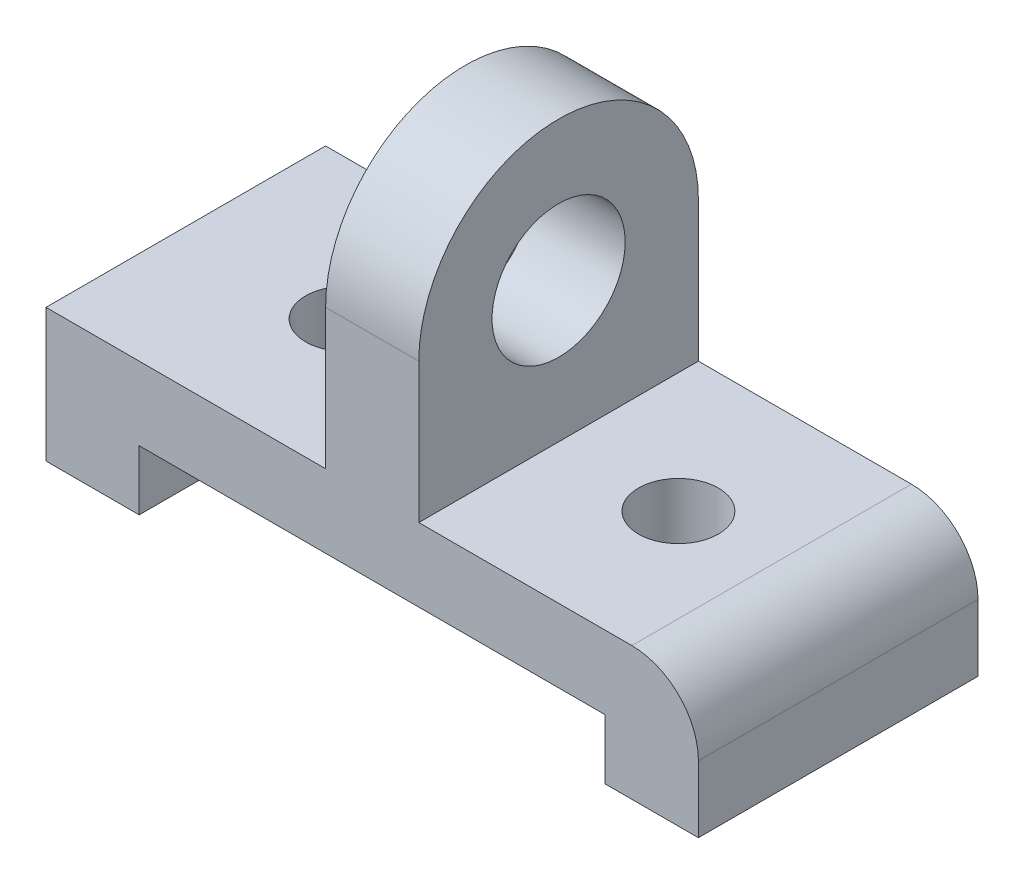
ISO-10303-21;
HEADER;
FILE_DESCRIPTION(('STEP AP214'),'2;1');
FILE_NAME('part.step','',(''),(''),'','','');
FILE_SCHEMA(('AUTOMOTIVE_DESIGN { 1 0 10303 214 1 1 1 1 }'));
ENDSEC;
DATA;
#1=APPLICATION_CONTEXT('core data for automotive mechanical design processes');
#2=APPLICATION_PROTOCOL_DEFINITION('international standard','automotive_design',2000,#1);
#3=PRODUCT_CONTEXT('',#1,'mechanical');
#4=PRODUCT('Part','Part','',(#3));
#5=PRODUCT_RELATED_PRODUCT_CATEGORY('part','',(#4));
#6=PRODUCT_DEFINITION_FORMATION('','',#4);
#7=PRODUCT_DEFINITION_CONTEXT('part definition',#1,'design');
#8=PRODUCT_DEFINITION('design','',#6,#7);
#9=PRODUCT_DEFINITION_SHAPE('','',#8);
#10=(LENGTH_UNIT() NAMED_UNIT(*) SI_UNIT(.MILLI.,.METRE.));
#11=(NAMED_UNIT(*) PLANE_ANGLE_UNIT() SI_UNIT($,.RADIAN.));
#12=(NAMED_UNIT(*) SI_UNIT($,.STERADIAN.) SOLID_ANGLE_UNIT());
#13=UNCERTAINTY_MEASURE_WITH_UNIT(LENGTH_MEASURE(1.E-05),#10,'distance_accuracy_value','');
#14=(GEOMETRIC_REPRESENTATION_CONTEXT(3) GLOBAL_UNCERTAINTY_ASSIGNED_CONTEXT((#13)) GLOBAL_UNIT_ASSIGNED_CONTEXT((#10,
#11,#12)) REPRESENTATION_CONTEXT('',''));
#15=CARTESIAN_POINT('',(0.,0.,0.));
#16=DIRECTION('',(0.,0.,1.));
#17=DIRECTION('',(1.,0.,0.));
#18=AXIS2_PLACEMENT_3D('',#15,#16,#17);
#19=CARTESIAN_POINT('',(0.,20.,0.));
#20=DIRECTION('',(0.,1.,0.));
#21=DIRECTION('',(0.,0.,1.));
#22=AXIS2_PLACEMENT_3D('',#19,#20,#21);
#23=PLANE('',#22);
#24=CARTESIAN_POINT('',(25.,20.,0.));
#25=DIRECTION('',(0.,1.,0.));
#26=DIRECTION('',(0.,0.,1.));
#27=AXIS2_PLACEMENT_3D('',#24,#25,#26);
#28=CIRCLE('',#27,6.);
#29=CARTESIAN_POINT('',(25.,20.,6.));
#30=VERTEX_POINT('',#29);
#31=EDGE_CURVE('E168',#30,#30,#28,.T.);
#32=ORIENTED_EDGE('',*,*,#31,.F.);
#33=EDGE_LOOP('',(#32));
#34=FACE_BOUND('',#33,.T.);
#35=DIRECTION('',(1.,0.,0.));
#36=VECTOR('',#35,1.);
#37=CARTESIAN_POINT('',(-49.,20.,21.));
#38=LINE('',#37,#36);
#39=CARTESIAN_POINT('',(7.,20.,21.));
#40=VERTEX_POINT('',#39);
#41=CARTESIAN_POINT('',(39.,20.,21.));
#42=VERTEX_POINT('',#41);
#43=EDGE_CURVE('E230',#40,#42,#38,.T.);
#44=ORIENTED_EDGE('',*,*,#43,.T.);
#45=DIRECTION('',(0.,0.,-1.));
#46=VECTOR('',#45,1.);
#47=CARTESIAN_POINT('',(39.,20.,-21.));
#48=LINE('',#47,#46);
#49=CARTESIAN_POINT('',(39.,20.,-21.));
#50=VERTEX_POINT('',#49);
#51=EDGE_CURVE('E264',#42,#50,#48,.T.);
#52=ORIENTED_EDGE('',*,*,#51,.T.);
#53=DIRECTION('',(-1.,0.,0.));
#54=VECTOR('',#53,1.);
#55=CARTESIAN_POINT('',(-49.,20.,-21.));
#56=LINE('',#55,#54);
#57=CARTESIAN_POINT('',(7.,20.,-21.));
#58=VERTEX_POINT('',#57);
#59=EDGE_CURVE('E223',#50,#58,#56,.T.);
#60=ORIENTED_EDGE('',*,*,#59,.T.);
#61=DIRECTION('',(0.,0.,-1.));
#62=VECTOR('',#61,1.);
#63=CARTESIAN_POINT('',(7.,20.,-21.));
#64=LINE('',#63,#62);
#65=EDGE_CURVE('E140',#40,#58,#64,.T.);
#66=ORIENTED_EDGE('',*,*,#65,.F.);
#67=EDGE_LOOP('',(#44,#52,#60,#66));
#68=FACE_BOUND('',#67,.T.);
#69=ADVANCED_FACE('F39',(#34,#68),#23,.T.);
#70=CARTESIAN_POINT('',(0.,0.,0.));
#71=DIRECTION('',(0.,1.,0.));
#72=DIRECTION('',(0.,0.,1.));
#73=AXIS2_PLACEMENT_3D('',#70,#71,#72);
#74=PLANE('',#73);
#75=DIRECTION('',(-1.,0.,0.));
#76=VECTOR('',#75,1.);
#77=CARTESIAN_POINT('',(-49.,0.,-21.));
#78=LINE('',#77,#76);
#79=CARTESIAN_POINT('',(-35.,0.,-21.));
#80=VERTEX_POINT('',#79);
#81=CARTESIAN_POINT('',(-49.,0.,-21.));
#82=VERTEX_POINT('',#81);
#83=EDGE_CURVE('E239',#80,#82,#78,.T.);
#84=ORIENTED_EDGE('',*,*,#83,.F.);
#85=DIRECTION('',(0.,0.,1.));
#86=VECTOR('',#85,1.);
#87=CARTESIAN_POINT('',(-35.,0.,-21.));
#88=LINE('',#87,#86);
#89=CARTESIAN_POINT('',(-35.,0.,21.));
#90=VERTEX_POINT('',#89);
#91=EDGE_CURVE('E200',#80,#90,#88,.T.);
#92=ORIENTED_EDGE('',*,*,#91,.T.);
#93=DIRECTION('',(1.,0.,0.));
#94=VECTOR('',#93,1.);
#95=CARTESIAN_POINT('',(-49.,0.,21.));
#96=LINE('',#95,#94);
#97=CARTESIAN_POINT('',(-49.,0.,21.));
#98=VERTEX_POINT('',#97);
#99=EDGE_CURVE('E248',#98,#90,#96,.T.);
#100=ORIENTED_EDGE('',*,*,#99,.F.);
#101=DIRECTION('',(0.,0.,1.));
#102=VECTOR('',#101,1.);
#103=CARTESIAN_POINT('',(-49.,0.,-21.));
#104=LINE('',#103,#102);
#105=EDGE_CURVE('E244',#82,#98,#104,.T.);
#106=ORIENTED_EDGE('',*,*,#105,.F.);
#107=EDGE_LOOP('',(#84,#92,#100,#106));
#108=FACE_BOUND('',#107,.T.);
#109=ADVANCED_FACE('F292',(#108),#74,.F.);
#110=CARTESIAN_POINT('',(49.,20.,-21.));
#111=DIRECTION('',(-1.,0.,0.));
#112=DIRECTION('',(0.,0.,1.));
#113=AXIS2_PLACEMENT_3D('',#110,#111,#112);
#114=PLANE('',#113);
#115=DIRECTION('',(0.,-1.,0.));
#116=VECTOR('',#115,1.);
#117=CARTESIAN_POINT('',(49.,20.,-21.));
#118=LINE('',#117,#116);
#119=CARTESIAN_POINT('',(49.,10.,-21.));
#120=VERTEX_POINT('',#119);
#121=CARTESIAN_POINT('',(49.,0.,-21.));
#122=VERTEX_POINT('',#121);
#123=EDGE_CURVE('E262',#120,#122,#118,.T.);
#124=ORIENTED_EDGE('',*,*,#123,.F.);
#125=DIRECTION('',(0.,0.,-1.));
#126=VECTOR('',#125,1.);
#127=CARTESIAN_POINT('',(49.,10.,21.));
#128=LINE('',#127,#126);
#129=CARTESIAN_POINT('',(49.,10.,21.));
#130=VERTEX_POINT('',#129);
#131=EDGE_CURVE('E48',#120,#130,#128,.F.);
#132=ORIENTED_EDGE('',*,*,#131,.T.);
#133=DIRECTION('',(0.,-1.,0.));
#134=VECTOR('',#133,1.);
#135=CARTESIAN_POINT('',(49.,20.,21.));
#136=LINE('',#135,#134);
#137=CARTESIAN_POINT('',(49.,0.,21.));
#138=VERTEX_POINT('',#137);
#139=EDGE_CURVE('E235',#130,#138,#136,.T.);
#140=ORIENTED_EDGE('',*,*,#139,.T.);
#141=DIRECTION('',(0.,0.,-1.));
#142=VECTOR('',#141,1.);
#143=CARTESIAN_POINT('',(49.,0.,-21.));
#144=LINE('',#143,#142);
#145=EDGE_CURVE('E213',#138,#122,#144,.T.);
#146=ORIENTED_EDGE('',*,*,#145,.T.);
#147=EDGE_LOOP('',(#124,#132,#140,#146));
#148=FACE_BOUND('',#147,.T.);
#149=ADVANCED_FACE('F325',(#148),#114,.F.);
#150=CARTESIAN_POINT('',(-49.,20.,-21.));
#151=DIRECTION('',(0.,0.,1.));
#152=DIRECTION('',(1.,0.,0.));
#153=AXIS2_PLACEMENT_3D('',#150,#151,#152);
#154=PLANE('',#153);
#155=ORIENTED_EDGE('',*,*,#59,.F.);
#156=CARTESIAN_POINT('',(39.,10.,-21.));
#157=DIRECTION('',(0.,0.,1.));
#158=DIRECTION('',(1.,0.,0.));
#159=AXIS2_PLACEMENT_3D('',#156,#157,#158);
#160=CIRCLE('',#159,10.);
#161=EDGE_CURVE('E62',#50,#120,#160,.F.);
#162=ORIENTED_EDGE('',*,*,#161,.T.);
#163=ORIENTED_EDGE('',*,*,#123,.T.);
#164=CARTESIAN_POINT('',(35.,0.,-21.));
#165=VERTEX_POINT('',#164);
#166=EDGE_CURVE('E240',#122,#165,#78,.T.);
#167=ORIENTED_EDGE('',*,*,#166,.T.);
#168=DIRECTION('',(0.,1.,0.));
#169=VECTOR('',#168,1.);
#170=CARTESIAN_POINT('',(35.,0.,-21.));
#171=LINE('',#170,#169);
#172=CARTESIAN_POINT('',(35.,9.,-21.));
#173=VERTEX_POINT('',#172);
#174=EDGE_CURVE('E191',#165,#173,#171,.T.);
#175=ORIENTED_EDGE('',*,*,#174,.T.);
#176=DIRECTION('',(-1.,0.,0.));
#177=VECTOR('',#176,1.);
#178=CARTESIAN_POINT('',(-35.,9.,-21.));
#179=LINE('',#178,#177);
#180=CARTESIAN_POINT('',(-35.,9.,-21.));
#181=VERTEX_POINT('',#180);
#182=EDGE_CURVE('E196',#173,#181,#179,.T.);
#183=ORIENTED_EDGE('',*,*,#182,.T.);
#184=DIRECTION('',(0.,-1.,0.));
#185=VECTOR('',#184,1.);
#186=CARTESIAN_POINT('',(-35.,0.,-21.));
#187=LINE('',#186,#185);
#188=EDGE_CURVE('E187',#181,#80,#187,.T.);
#189=ORIENTED_EDGE('',*,*,#188,.T.);
#190=ORIENTED_EDGE('',*,*,#83,.T.);
#191=DIRECTION('',(0.,-1.,0.));
#192=VECTOR('',#191,1.);
#193=CARTESIAN_POINT('',(-49.,20.,-21.));
#194=LINE('',#193,#192);
#195=CARTESIAN_POINT('',(-49.,20.,-21.));
#196=VERTEX_POINT('',#195);
#197=EDGE_CURVE('E258',#196,#82,#194,.T.);
#198=ORIENTED_EDGE('',*,*,#197,.F.);
#199=CARTESIAN_POINT('',(-7.,20.,-21.));
#200=VERTEX_POINT('',#199);
#201=EDGE_CURVE('E227',#200,#196,#56,.T.);
#202=ORIENTED_EDGE('',*,*,#201,.F.);
#203=DIRECTION('',(0.,-1.,0.));
#204=VECTOR('',#203,1.);
#205=CARTESIAN_POINT('',(-7.,41.,-21.));
#206=LINE('',#205,#204);
#207=CARTESIAN_POINT('',(-7.,41.,-21.));
#208=VERTEX_POINT('',#207);
#209=EDGE_CURVE('E143',#208,#200,#206,.T.);
#210=ORIENTED_EDGE('',*,*,#209,.F.);
#211=DIRECTION('',(-1.,0.,0.));
#212=VECTOR('',#211,1.);
#213=CARTESIAN_POINT('',(-7.,41.,-21.));
#214=LINE('',#213,#212);
#215=CARTESIAN_POINT('',(7.,41.,-21.));
#216=VERTEX_POINT('',#215);
#217=EDGE_CURVE('E146',#216,#208,#214,.T.);
#218=ORIENTED_EDGE('',*,*,#217,.F.);
#219=DIRECTION('',(0.,-1.,0.));
#220=VECTOR('',#219,1.);
#221=CARTESIAN_POINT('',(7.,41.,-21.));
#222=LINE('',#221,#220);
#223=EDGE_CURVE('E134',#216,#58,#222,.T.);
#224=ORIENTED_EDGE('',*,*,#223,.T.);
#225=EDGE_LOOP('',(#155,#162,#163,#167,#175,#183,#189,#190,#198,#202,#210,#218,#224));
#226=FACE_BOUND('',#225,.T.);
#227=ADVANCED_FACE('F147',(#226),#154,.F.);
#228=CARTESIAN_POINT('',(-49.,20.,-21.));
#229=DIRECTION('',(1.,0.,0.));
#230=DIRECTION('',(0.,0.,-1.));
#231=AXIS2_PLACEMENT_3D('',#228,#229,#230);
#232=PLANE('',#231);
#233=ORIENTED_EDGE('',*,*,#105,.T.);
#234=DIRECTION('',(0.,-1.,0.));
#235=VECTOR('',#234,1.);
#236=CARTESIAN_POINT('',(-49.,20.,21.));
#237=LINE('',#236,#235);
#238=CARTESIAN_POINT('',(-49.,20.,21.));
#239=VERTEX_POINT('',#238);
#240=EDGE_CURVE('E254',#239,#98,#237,.T.);
#241=ORIENTED_EDGE('',*,*,#240,.F.);
#242=DIRECTION('',(0.,0.,1.));
#243=VECTOR('',#242,1.);
#244=CARTESIAN_POINT('',(-49.,20.,-21.));
#245=LINE('',#244,#243);
#246=EDGE_CURVE('E226',#196,#239,#245,.T.);
#247=ORIENTED_EDGE('',*,*,#246,.F.);
#248=ORIENTED_EDGE('',*,*,#197,.T.);
#249=EDGE_LOOP('',(#233,#241,#247,#248));
#250=FACE_BOUND('',#249,.T.);
#251=ADVANCED_FACE('F289',(#250),#232,.F.);
#252=CARTESIAN_POINT('',(-49.,20.,21.));
#253=DIRECTION('',(0.,0.,-1.));
#254=DIRECTION('',(-1.,0.,0.));
#255=AXIS2_PLACEMENT_3D('',#252,#253,#254);
#256=PLANE('',#255);
#257=ORIENTED_EDGE('',*,*,#139,.F.);
#258=CARTESIAN_POINT('',(39.,10.,21.));
#259=DIRECTION('',(0.,0.,-1.));
#260=DIRECTION('',(-1.,0.,0.));
#261=AXIS2_PLACEMENT_3D('',#258,#259,#260);
#262=CIRCLE('',#261,10.);
#263=EDGE_CURVE('E11',#130,#42,#262,.F.);
#264=ORIENTED_EDGE('',*,*,#263,.T.);
#265=ORIENTED_EDGE('',*,*,#43,.F.);
#266=DIRECTION('',(0.,-1.,0.));
#267=VECTOR('',#266,1.);
#268=CARTESIAN_POINT('',(7.,41.,21.));
#269=LINE('',#268,#267);
#270=CARTESIAN_POINT('',(7.,41.,21.));
#271=VERTEX_POINT('',#270);
#272=EDGE_CURVE('E174',#271,#40,#269,.T.);
#273=ORIENTED_EDGE('',*,*,#272,.F.);
#274=DIRECTION('',(1.,0.,0.));
#275=VECTOR('',#274,1.);
#276=CARTESIAN_POINT('',(-7.,41.,21.));
#277=LINE('',#276,#275);
#278=CARTESIAN_POINT('',(-7.,41.,21.));
#279=VERTEX_POINT('',#278);
#280=EDGE_CURVE('E154',#279,#271,#277,.T.);
#281=ORIENTED_EDGE('',*,*,#280,.F.);
#282=DIRECTION('',(0.,-1.,0.));
#283=VECTOR('',#282,1.);
#284=CARTESIAN_POINT('',(-7.,41.,21.));
#285=LINE('',#284,#283);
#286=CARTESIAN_POINT('',(-7.,20.,21.));
#287=VERTEX_POINT('',#286);
#288=EDGE_CURVE('E181',#279,#287,#285,.T.);
#289=ORIENTED_EDGE('',*,*,#288,.T.);
#290=EDGE_CURVE('E231',#239,#287,#38,.T.);
#291=ORIENTED_EDGE('',*,*,#290,.F.);
#292=ORIENTED_EDGE('',*,*,#240,.T.);
#293=ORIENTED_EDGE('',*,*,#99,.T.);
#294=DIRECTION('',(0.,-1.,0.));
#295=VECTOR('',#294,1.);
#296=CARTESIAN_POINT('',(-35.,0.,21.));
#297=LINE('',#296,#295);
#298=CARTESIAN_POINT('',(-35.,9.,21.));
#299=VERTEX_POINT('',#298);
#300=EDGE_CURVE('E142',#299,#90,#297,.T.);
#301=ORIENTED_EDGE('',*,*,#300,.F.);
#302=DIRECTION('',(-1.,0.,0.));
#303=VECTOR('',#302,1.);
#304=CARTESIAN_POINT('',(-35.,9.,21.));
#305=LINE('',#304,#303);
#306=CARTESIAN_POINT('',(35.,9.,21.));
#307=VERTEX_POINT('',#306);
#308=EDGE_CURVE('E192',#307,#299,#305,.T.);
#309=ORIENTED_EDGE('',*,*,#308,.F.);
#310=DIRECTION('',(0.,1.,0.));
#311=VECTOR('',#310,1.);
#312=CARTESIAN_POINT('',(35.,0.,21.));
#313=LINE('',#312,#311);
#314=CARTESIAN_POINT('',(35.,0.,21.));
#315=VERTEX_POINT('',#314);
#316=EDGE_CURVE('E203',#315,#307,#313,.T.);
#317=ORIENTED_EDGE('',*,*,#316,.F.);
#318=EDGE_CURVE('E247',#315,#138,#96,.T.);
#319=ORIENTED_EDGE('',*,*,#318,.T.);
#320=EDGE_LOOP('',(#257,#264,#265,#273,#281,#289,#291,#292,#293,#301,#309,#317,#319));
#321=FACE_BOUND('',#320,.T.);
#322=ADVANCED_FACE('F295',(#321),#256,.F.);
#323=CARTESIAN_POINT('',(-25.,20.,0.));
#324=DIRECTION('',(0.,-1.,0.));
#325=DIRECTION('',(0.,0.,1.));
#326=AXIS2_PLACEMENT_3D('',#323,#324,#325);
#327=CIRCLE('',#326,6.);
#328=CARTESIAN_POINT('',(-25.,20.,6.));
#329=VERTEX_POINT('',#328);
#330=EDGE_CURVE('E270',#329,#329,#327,.T.);
#331=ORIENTED_EDGE('',*,*,#330,.T.);
#332=EDGE_LOOP('',(#331));
#333=FACE_BOUND('',#332,.T.);
#334=DIRECTION('',(0.,0.,1.));
#335=VECTOR('',#334,1.);
#336=CARTESIAN_POINT('',(-7.,20.,-21.));
#337=LINE('',#336,#335);
#338=EDGE_CURVE('E155',#200,#287,#337,.T.);
#339=ORIENTED_EDGE('',*,*,#338,.F.);
#340=ORIENTED_EDGE('',*,*,#201,.T.);
#341=ORIENTED_EDGE('',*,*,#246,.T.);
#342=ORIENTED_EDGE('',*,*,#290,.T.);
#343=EDGE_LOOP('',(#339,#340,#341,#342));
#344=FACE_BOUND('',#343,.T.);
#345=ADVANCED_FACE('F299',(#333,#344),#23,.T.);
#346=ORIENTED_EDGE('',*,*,#318,.F.);
#347=DIRECTION('',(0.,0.,1.));
#348=VECTOR('',#347,1.);
#349=CARTESIAN_POINT('',(35.,0.,-21.));
#350=LINE('',#349,#348);
#351=EDGE_CURVE('E217',#165,#315,#350,.T.);
#352=ORIENTED_EDGE('',*,*,#351,.F.);
#353=ORIENTED_EDGE('',*,*,#166,.F.);
#354=ORIENTED_EDGE('',*,*,#145,.F.);
#355=EDGE_LOOP('',(#346,#352,#353,#354));
#356=FACE_BOUND('',#355,.T.);
#357=ADVANCED_FACE('F327',(#356),#74,.F.);
#358=CARTESIAN_POINT('',(-35.,0.,-21.));
#359=DIRECTION('',(-1.,0.,0.));
#360=DIRECTION('',(0.,0.,1.));
#361=AXIS2_PLACEMENT_3D('',#358,#359,#360);
#362=PLANE('',#361);
#363=ORIENTED_EDGE('',*,*,#300,.T.);
#364=ORIENTED_EDGE('',*,*,#91,.F.);
#365=ORIENTED_EDGE('',*,*,#188,.F.);
#366=DIRECTION('',(0.,0.,1.));
#367=VECTOR('',#366,1.);
#368=CARTESIAN_POINT('',(-35.,9.,-21.));
#369=LINE('',#368,#367);
#370=EDGE_CURVE('E210',#181,#299,#369,.T.);
#371=ORIENTED_EDGE('',*,*,#370,.T.);
#372=EDGE_LOOP('',(#363,#364,#365,#371));
#373=FACE_BOUND('',#372,.T.);
#374=ADVANCED_FACE('F336',(#373),#362,.F.);
#375=CARTESIAN_POINT('',(-35.,9.,-21.));
#376=DIRECTION('',(0.,1.,0.));
#377=DIRECTION('',(0.,0.,1.));
#378=AXIS2_PLACEMENT_3D('',#375,#376,#377);
#379=PLANE('',#378);
#380=CARTESIAN_POINT('',(-25.,9.,0.));
#381=DIRECTION('',(0.,1.,0.));
#382=DIRECTION('',(0.,0.,1.));
#383=AXIS2_PLACEMENT_3D('',#380,#381,#382);
#384=CIRCLE('',#383,6.);
#385=CARTESIAN_POINT('',(-25.,9.,6.));
#386=VERTEX_POINT('',#385);
#387=EDGE_CURVE('E266',#386,#386,#384,.F.);
#388=ORIENTED_EDGE('',*,*,#387,.F.);
#389=EDGE_LOOP('',(#388));
#390=FACE_BOUND('',#389,.T.);
#391=CARTESIAN_POINT('',(25.,9.,0.));
#392=DIRECTION('',(0.,1.,0.));
#393=DIRECTION('',(0.,0.,1.));
#394=AXIS2_PLACEMENT_3D('',#391,#392,#393);
#395=CIRCLE('',#394,6.);
#396=CARTESIAN_POINT('',(25.,9.,6.));
#397=VERTEX_POINT('',#396);
#398=EDGE_CURVE('E162',#397,#397,#395,.T.);
#399=ORIENTED_EDGE('',*,*,#398,.T.);
#400=EDGE_LOOP('',(#399));
#401=FACE_BOUND('',#400,.T.);
#402=ORIENTED_EDGE('',*,*,#308,.T.);
#403=ORIENTED_EDGE('',*,*,#370,.F.);
#404=ORIENTED_EDGE('',*,*,#182,.F.);
#405=DIRECTION('',(0.,0.,1.));
#406=VECTOR('',#405,1.);
#407=CARTESIAN_POINT('',(35.,9.,-21.));
#408=LINE('',#407,#406);
#409=EDGE_CURVE('E214',#173,#307,#408,.T.);
#410=ORIENTED_EDGE('',*,*,#409,.T.);
#411=EDGE_LOOP('',(#402,#403,#404,#410));
#412=FACE_BOUND('',#411,.T.);
#413=ADVANCED_FACE('F357',(#390,#401,#412),#379,.F.);
#414=CARTESIAN_POINT('',(35.,0.,-21.));
#415=DIRECTION('',(1.,0.,0.));
#416=DIRECTION('',(0.,0.,-1.));
#417=AXIS2_PLACEMENT_3D('',#414,#415,#416);
#418=PLANE('',#417);
#419=ORIENTED_EDGE('',*,*,#316,.T.);
#420=ORIENTED_EDGE('',*,*,#409,.F.);
#421=ORIENTED_EDGE('',*,*,#174,.F.);
#422=ORIENTED_EDGE('',*,*,#351,.T.);
#423=EDGE_LOOP('',(#419,#420,#421,#422));
#424=FACE_BOUND('',#423,.T.);
#425=ADVANCED_FACE('F360',(#424),#418,.F.);
#426=CARTESIAN_POINT('',(7.,41.,-21.));
#427=DIRECTION('',(-1.,0.,0.));
#428=DIRECTION('',(0.,0.,1.));
#429=AXIS2_PLACEMENT_3D('',#426,#427,#428);
#430=PLANE('',#429);
#431=CARTESIAN_POINT('',(7.,41.,0.));
#432=DIRECTION('',(1.,0.,0.));
#433=DIRECTION('',(0.,0.,-1.));
#434=AXIS2_PLACEMENT_3D('',#431,#432,#433);
#435=CIRCLE('',#434,10.);
#436=CARTESIAN_POINT('',(7.,41.,-10.));
#437=VERTEX_POINT('',#436);
#438=EDGE_CURVE('E346',#437,#437,#435,.T.);
#439=ORIENTED_EDGE('',*,*,#438,.F.);
#440=EDGE_LOOP('',(#439));
#441=FACE_BOUND('',#440,.T.);
#442=ORIENTED_EDGE('',*,*,#65,.T.);
#443=ORIENTED_EDGE('',*,*,#223,.F.);
#444=CARTESIAN_POINT('',(7.,41.,0.));
#445=DIRECTION('',(1.,0.,0.));
#446=DIRECTION('',(0.,0.,-1.));
#447=AXIS2_PLACEMENT_3D('',#444,#445,#446);
#448=CIRCLE('',#447,21.);
#449=EDGE_CURVE('E139',#216,#271,#448,.T.);
#450=ORIENTED_EDGE('',*,*,#449,.T.);
#451=ORIENTED_EDGE('',*,*,#272,.T.);
#452=EDGE_LOOP('',(#442,#443,#450,#451));
#453=FACE_BOUND('',#452,.T.);
#454=ADVANCED_FACE('F136',(#441,#453),#430,.F.);
#455=CARTESIAN_POINT('',(-7.,41.,-21.));
#456=DIRECTION('',(1.,0.,0.));
#457=DIRECTION('',(0.,0.,-1.));
#458=AXIS2_PLACEMENT_3D('',#455,#456,#457);
#459=PLANE('',#458);
#460=CARTESIAN_POINT('',(-7.,41.,0.));
#461=DIRECTION('',(1.,0.,0.));
#462=DIRECTION('',(0.,0.,-1.));
#463=AXIS2_PLACEMENT_3D('',#460,#461,#462);
#464=CIRCLE('',#463,10.);
#465=CARTESIAN_POINT('',(-7.,41.,-10.));
#466=VERTEX_POINT('',#465);
#467=EDGE_CURVE('E342',#466,#466,#464,.T.);
#468=ORIENTED_EDGE('',*,*,#467,.T.);
#469=EDGE_LOOP('',(#468));
#470=FACE_BOUND('',#469,.T.);
#471=ORIENTED_EDGE('',*,*,#338,.T.);
#472=ORIENTED_EDGE('',*,*,#288,.F.);
#473=CARTESIAN_POINT('',(-7.,41.,0.));
#474=DIRECTION('',(1.,0.,0.));
#475=DIRECTION('',(0.,0.,-1.));
#476=AXIS2_PLACEMENT_3D('',#473,#474,#475);
#477=CIRCLE('',#476,21.);
#478=EDGE_CURVE('E161',#208,#279,#477,.T.);
#479=ORIENTED_EDGE('',*,*,#478,.F.);
#480=ORIENTED_EDGE('',*,*,#209,.T.);
#481=EDGE_LOOP('',(#471,#472,#479,#480));
#482=FACE_BOUND('',#481,.T.);
#483=ADVANCED_FACE('F301',(#470,#482),#459,.F.);
#484=CARTESIAN_POINT('',(-7.,41.,0.));
#485=DIRECTION('',(1.,0.,0.));
#486=DIRECTION('',(0.,0.,-1.));
#487=AXIS2_PLACEMENT_3D('',#484,#485,#486);
#488=CYLINDRICAL_SURFACE('',#487,21.);
#489=ORIENTED_EDGE('',*,*,#478,.T.);
#490=ORIENTED_EDGE('',*,*,#280,.T.);
#491=ORIENTED_EDGE('',*,*,#449,.F.);
#492=ORIENTED_EDGE('',*,*,#217,.T.);
#493=EDGE_LOOP('',(#489,#490,#491,#492));
#494=FACE_BOUND('',#493,.T.);
#495=ADVANCED_FACE('F158',(#494),#488,.T.);
#496=CARTESIAN_POINT('',(25.,0.,0.));
#497=DIRECTION('',(0.,1.,0.));
#498=DIRECTION('',(0.,0.,1.));
#499=AXIS2_PLACEMENT_3D('',#496,#497,#498);
#500=CYLINDRICAL_SURFACE('',#499,6.);
#501=ORIENTED_EDGE('',*,*,#31,.T.);
#502=EDGE_LOOP('',(#501));
#503=FACE_BOUND('',#502,.T.);
#504=ORIENTED_EDGE('',*,*,#398,.F.);
#505=EDGE_LOOP('',(#504));
#506=FACE_BOUND('',#505,.T.);
#507=ADVANCED_FACE('F316',(#503,#506),#500,.F.);
#508=CARTESIAN_POINT('',(-25.,0.,0.));
#509=DIRECTION('',(0.,1.,0.));
#510=DIRECTION('',(0.,0.,1.));
#511=AXIS2_PLACEMENT_3D('',#508,#509,#510);
#512=CYLINDRICAL_SURFACE('',#511,6.);
#513=ORIENTED_EDGE('',*,*,#330,.F.);
#514=EDGE_LOOP('',(#513));
#515=FACE_BOUND('',#514,.T.);
#516=ORIENTED_EDGE('',*,*,#387,.T.);
#517=EDGE_LOOP('',(#516));
#518=FACE_BOUND('',#517,.T.);
#519=ADVANCED_FACE('F309',(#515,#518),#512,.F.);
#520=CARTESIAN_POINT('',(39.,10.,0.));
#521=DIRECTION('',(0.,0.,1.));
#522=DIRECTION('',(1.,0.,0.));
#523=AXIS2_PLACEMENT_3D('',#520,#521,#522);
#524=CYLINDRICAL_SURFACE('',#523,10.);
#525=ORIENTED_EDGE('',*,*,#263,.F.);
#526=ORIENTED_EDGE('',*,*,#131,.F.);
#527=ORIENTED_EDGE('',*,*,#161,.F.);
#528=ORIENTED_EDGE('',*,*,#51,.F.);
#529=EDGE_LOOP('',(#525,#526,#527,#528));
#530=FACE_BOUND('',#529,.T.);
#531=ADVANCED_FACE('F41',(#530),#524,.T.);
#532=CARTESIAN_POINT('',(-7.,41.,0.));
#533=DIRECTION('',(1.,0.,0.));
#534=DIRECTION('',(0.,0.,-1.));
#535=AXIS2_PLACEMENT_3D('',#532,#533,#534);
#536=CYLINDRICAL_SURFACE('',#535,10.);
#537=ORIENTED_EDGE('',*,*,#467,.F.);
#538=EDGE_LOOP('',(#537));
#539=FACE_BOUND('',#538,.T.);
#540=ORIENTED_EDGE('',*,*,#438,.T.);
#541=EDGE_LOOP('',(#540));
#542=FACE_BOUND('',#541,.T.);
#543=ADVANCED_FACE('F308',(#539,#542),#536,.F.);
#544=CLOSED_SHELL('',(#69,#109,#149,#227,#251,#322,#345,#357,#374,#413,#425,#454,#483,#495,#507,
#519,#531,#543));
#545=MANIFOLD_SOLID_BREP('B2',#544);
#546=ADVANCED_BREP_SHAPE_REPRESENTATION('',(#18,#545),#14);
#547=SHAPE_DEFINITION_REPRESENTATION(#9,#546);
ENDSEC;
END-ISO-10303-21;
